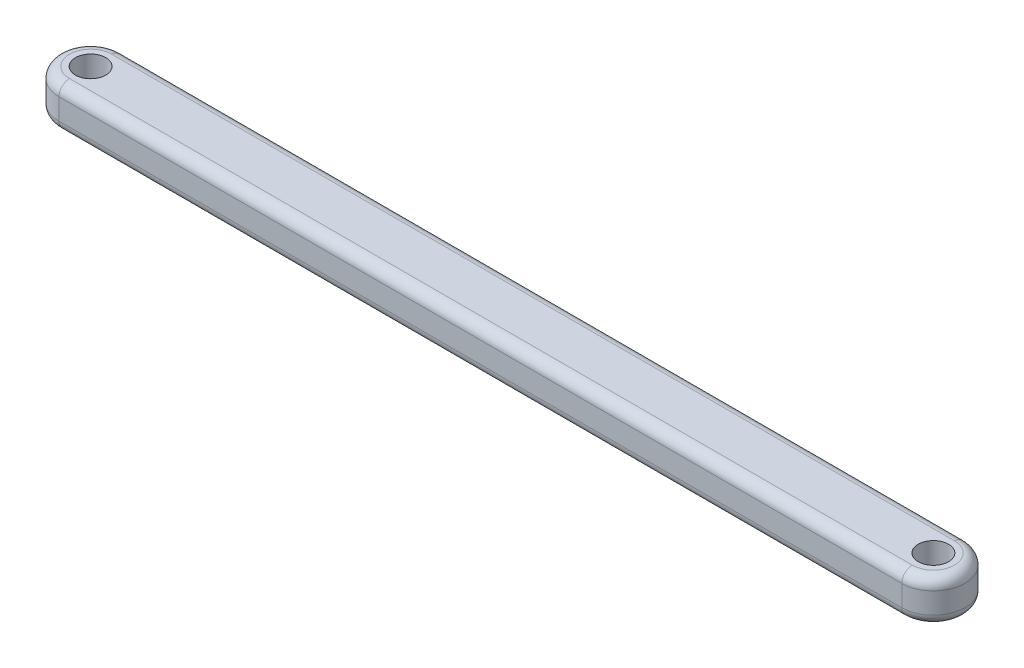
ISO-10303-21;
HEADER;
FILE_DESCRIPTION(('STEP AP214'),'2;1');
FILE_NAME('part.step','',(''),(''),'','','');
FILE_SCHEMA(('AUTOMOTIVE_DESIGN { 1 0 10303 214 1 1 1 1 }'));
ENDSEC;
DATA;
#1=APPLICATION_CONTEXT('core data for automotive mechanical design processes');
#2=APPLICATION_PROTOCOL_DEFINITION('international standard','automotive_design',2000,#1);
#3=PRODUCT_CONTEXT('',#1,'mechanical');
#4=PRODUCT('Part','Part','',(#3));
#5=PRODUCT_RELATED_PRODUCT_CATEGORY('part','',(#4));
#6=PRODUCT_DEFINITION_FORMATION('','',#4);
#7=PRODUCT_DEFINITION_CONTEXT('part definition',#1,'design');
#8=PRODUCT_DEFINITION('design','',#6,#7);
#9=PRODUCT_DEFINITION_SHAPE('','',#8);
#10=(LENGTH_UNIT() NAMED_UNIT(*) SI_UNIT(.MILLI.,.METRE.));
#11=(NAMED_UNIT(*) PLANE_ANGLE_UNIT() SI_UNIT($,.RADIAN.));
#12=(NAMED_UNIT(*) SI_UNIT($,.STERADIAN.) SOLID_ANGLE_UNIT());
#13=UNCERTAINTY_MEASURE_WITH_UNIT(LENGTH_MEASURE(1.E-05),#10,'distance_accuracy_value','');
#14=(GEOMETRIC_REPRESENTATION_CONTEXT(3) GLOBAL_UNCERTAINTY_ASSIGNED_CONTEXT((#13)) GLOBAL_UNIT_ASSIGNED_CONTEXT((#10,
#11,#12)) REPRESENTATION_CONTEXT('',''));
#15=CARTESIAN_POINT('',(0.,0.,0.));
#16=DIRECTION('',(0.,0.,1.));
#17=DIRECTION('',(1.,0.,0.));
#18=AXIS2_PLACEMENT_3D('',#15,#16,#17);
#19=CARTESIAN_POINT('',(0.,3.175,0.));
#20=DIRECTION('',(0.,-1.,0.));
#21=DIRECTION('',(0.,0.,-1.));
#22=AXIS2_PLACEMENT_3D('',#19,#20,#21);
#23=CYLINDRICAL_SURFACE('',#22,4.7625);
#24=DIRECTION('',(0.,-1.,0.));
#25=VECTOR('',#24,1.);
#26=CARTESIAN_POINT('',(0.,3.175,-4.7625));
#27=LINE('',#26,#25);
#28=CARTESIAN_POINT('',(0.,1.5875,-4.7625));
#29=VERTEX_POINT('',#28);
#30=CARTESIAN_POINT('',(0.,-1.5875,-4.7625));
#31=VERTEX_POINT('',#30);
#32=EDGE_CURVE('E117',#29,#31,#27,.T.);
#33=ORIENTED_EDGE('',*,*,#32,.T.);
#34=CARTESIAN_POINT('',(0.,-1.5875,0.));
#35=DIRECTION('',(0.,1.,0.));
#36=DIRECTION('',(0.,0.,1.));
#37=AXIS2_PLACEMENT_3D('',#34,#35,#36);
#38=CIRCLE('',#37,4.7625);
#39=CARTESIAN_POINT('',(0.,-1.5875,4.7625));
#40=VERTEX_POINT('',#39);
#41=EDGE_CURVE('E229',#31,#40,#38,.T.);
#42=ORIENTED_EDGE('',*,*,#41,.T.);
#43=DIRECTION('',(0.,-1.,0.));
#44=VECTOR('',#43,1.);
#45=CARTESIAN_POINT('',(0.,3.175,4.7625));
#46=LINE('',#45,#44);
#47=CARTESIAN_POINT('',(0.,1.5875,4.7625));
#48=VERTEX_POINT('',#47);
#49=EDGE_CURVE('E146',#48,#40,#46,.T.);
#50=ORIENTED_EDGE('',*,*,#49,.F.);
#51=CARTESIAN_POINT('',(0.,1.5875,0.));
#52=DIRECTION('',(0.,1.,0.));
#53=DIRECTION('',(0.,0.,1.));
#54=AXIS2_PLACEMENT_3D('',#51,#52,#53);
#55=CIRCLE('',#54,4.7625);
#56=EDGE_CURVE('E226',#48,#29,#55,.F.);
#57=ORIENTED_EDGE('',*,*,#56,.T.);
#58=EDGE_LOOP('',(#33,#42,#50,#57));
#59=FACE_BOUND('',#58,.T.);
#60=ADVANCED_FACE('F45',(#59),#23,.T.);
#61=CARTESIAN_POINT('',(0.,3.175,4.7625));
#62=DIRECTION('',(0.,0.,-1.));
#63=DIRECTION('',(-1.,0.,0.));
#64=AXIS2_PLACEMENT_3D('',#61,#62,#63);
#65=PLANE('',#64);
#66=ORIENTED_EDGE('',*,*,#49,.T.);
#67=DIRECTION('',(1.,0.,0.));
#68=VECTOR('',#67,1.);
#69=CARTESIAN_POINT('',(0.,-1.5875,4.7625));
#70=LINE('',#69,#68);
#71=CARTESIAN_POINT('',(127.,-1.5875,4.7625));
#72=VERTEX_POINT('',#71);
#73=EDGE_CURVE('E223',#40,#72,#70,.T.);
#74=ORIENTED_EDGE('',*,*,#73,.T.);
#75=DIRECTION('',(0.,-1.,0.));
#76=VECTOR('',#75,1.);
#77=CARTESIAN_POINT('',(127.,3.175,4.7625));
#78=LINE('',#77,#76);
#79=CARTESIAN_POINT('',(127.,1.5875,4.7625));
#80=VERTEX_POINT('',#79);
#81=EDGE_CURVE('E136',#80,#72,#78,.T.);
#82=ORIENTED_EDGE('',*,*,#81,.F.);
#83=DIRECTION('',(1.,0.,0.));
#84=VECTOR('',#83,1.);
#85=CARTESIAN_POINT('',(0.,1.5875,4.7625));
#86=LINE('',#85,#84);
#87=EDGE_CURVE('E220',#80,#48,#86,.F.);
#88=ORIENTED_EDGE('',*,*,#87,.T.);
#89=EDGE_LOOP('',(#66,#74,#82,#88));
#90=FACE_BOUND('',#89,.T.);
#91=ADVANCED_FACE('F246',(#90),#65,.F.);
#92=CARTESIAN_POINT('',(127.,3.175,0.));
#93=DIRECTION('',(0.,-1.,0.));
#94=DIRECTION('',(0.,0.,-1.));
#95=AXIS2_PLACEMENT_3D('',#92,#93,#94);
#96=CYLINDRICAL_SURFACE('',#95,4.7625);
#97=ORIENTED_EDGE('',*,*,#81,.T.);
#98=CARTESIAN_POINT('',(127.,-1.5875,0.));
#99=DIRECTION('',(0.,1.,0.));
#100=DIRECTION('',(0.,0.,1.));
#101=AXIS2_PLACEMENT_3D('',#98,#99,#100);
#102=CIRCLE('',#101,4.7625);
#103=CARTESIAN_POINT('',(127.,-1.5875,-4.7625));
#104=VERTEX_POINT('',#103);
#105=EDGE_CURVE('E134',#72,#104,#102,.T.);
#106=ORIENTED_EDGE('',*,*,#105,.T.);
#107=DIRECTION('',(0.,-1.,0.));
#108=VECTOR('',#107,1.);
#109=CARTESIAN_POINT('',(127.,3.175,-4.7625));
#110=LINE('',#109,#108);
#111=CARTESIAN_POINT('',(127.,1.5875,-4.7625));
#112=VERTEX_POINT('',#111);
#113=EDGE_CURVE('E115',#112,#104,#110,.T.);
#114=ORIENTED_EDGE('',*,*,#113,.F.);
#115=CARTESIAN_POINT('',(127.,1.5875,0.));
#116=DIRECTION('',(0.,1.,0.));
#117=DIRECTION('',(0.,0.,1.));
#118=AXIS2_PLACEMENT_3D('',#115,#116,#117);
#119=CIRCLE('',#118,4.7625);
#120=EDGE_CURVE('E131',#112,#80,#119,.F.);
#121=ORIENTED_EDGE('',*,*,#120,.T.);
#122=EDGE_LOOP('',(#97,#106,#114,#121));
#123=FACE_BOUND('',#122,.T.);
#124=ADVANCED_FACE('F130',(#123),#96,.T.);
#125=CARTESIAN_POINT('',(0.,3.175,-4.7625));
#126=DIRECTION('',(0.,0.,1.));
#127=DIRECTION('',(1.,0.,0.));
#128=AXIS2_PLACEMENT_3D('',#125,#126,#127);
#129=PLANE('',#128);
#130=ORIENTED_EDGE('',*,*,#113,.T.);
#131=DIRECTION('',(-1.,0.,0.));
#132=VECTOR('',#131,1.);
#133=CARTESIAN_POINT('',(0.,-1.5875,-4.7625));
#134=LINE('',#133,#132);
#135=EDGE_CURVE('E11',#104,#31,#134,.T.);
#136=ORIENTED_EDGE('',*,*,#135,.T.);
#137=ORIENTED_EDGE('',*,*,#32,.F.);
#138=DIRECTION('',(-1.,0.,0.));
#139=VECTOR('',#138,1.);
#140=CARTESIAN_POINT('',(127.,1.5875,-4.7625));
#141=LINE('',#140,#139);
#142=EDGE_CURVE('E55',#29,#112,#141,.F.);
#143=ORIENTED_EDGE('',*,*,#142,.T.);
#144=EDGE_LOOP('',(#130,#136,#137,#143));
#145=FACE_BOUND('',#144,.T.);
#146=ADVANCED_FACE('F114',(#145),#129,.F.);
#147=CARTESIAN_POINT('',(0.,3.175,0.));
#148=DIRECTION('',(0.,1.,0.));
#149=DIRECTION('',(0.,0.,1.));
#150=AXIS2_PLACEMENT_3D('',#147,#148,#149);
#151=PLANE('',#150);
#152=DIRECTION('',(1.,0.,0.));
#153=VECTOR('',#152,1.);
#154=CARTESIAN_POINT('',(127.,3.175,3.175));
#155=LINE('',#154,#153);
#156=CARTESIAN_POINT('',(0.,3.175,3.175));
#157=VERTEX_POINT('',#156);
#158=CARTESIAN_POINT('',(127.,3.175,3.175));
#159=VERTEX_POINT('',#158);
#160=EDGE_CURVE('E63',#157,#159,#155,.T.);
#161=ORIENTED_EDGE('',*,*,#160,.T.);
#162=CARTESIAN_POINT('',(127.,3.175,0.));
#163=DIRECTION('',(0.,1.,0.));
#164=DIRECTION('',(0.,0.,1.));
#165=AXIS2_PLACEMENT_3D('',#162,#163,#164);
#166=CIRCLE('',#165,3.175);
#167=CARTESIAN_POINT('',(127.,3.175,-3.175));
#168=VERTEX_POINT('',#167);
#169=EDGE_CURVE('E123',#159,#168,#166,.T.);
#170=ORIENTED_EDGE('',*,*,#169,.T.);
#171=DIRECTION('',(-1.,0.,0.));
#172=VECTOR('',#171,1.);
#173=CARTESIAN_POINT('',(0.,3.175,-3.175));
#174=LINE('',#173,#172);
#175=CARTESIAN_POINT('',(0.,3.175,-3.175));
#176=VERTEX_POINT('',#175);
#177=EDGE_CURVE('E149',#168,#176,#174,.T.);
#178=ORIENTED_EDGE('',*,*,#177,.T.);
#179=CARTESIAN_POINT('',(0.,3.175,0.));
#180=DIRECTION('',(0.,1.,0.));
#181=DIRECTION('',(0.,0.,1.));
#182=AXIS2_PLACEMENT_3D('',#179,#180,#181);
#183=CIRCLE('',#182,3.175);
#184=EDGE_CURVE('E68',#176,#157,#183,.T.);
#185=ORIENTED_EDGE('',*,*,#184,.T.);
#186=EDGE_LOOP('',(#161,#170,#178,#185));
#187=FACE_BOUND('',#186,.T.);
#188=CARTESIAN_POINT('',(0.,3.175,0.));
#189=DIRECTION('',(0.,1.,0.));
#190=DIRECTION('',(0.,0.,1.));
#191=AXIS2_PLACEMENT_3D('',#188,#189,#190);
#192=CIRCLE('',#191,2.286);
#193=CARTESIAN_POINT('',(0.,3.175,2.286));
#194=VERTEX_POINT('',#193);
#195=EDGE_CURVE('E193',#194,#194,#192,.T.);
#196=ORIENTED_EDGE('',*,*,#195,.F.);
#197=EDGE_LOOP('',(#196));
#198=FACE_BOUND('',#197,.T.);
#199=CARTESIAN_POINT('',(127.,3.175,0.));
#200=DIRECTION('',(0.,1.,0.));
#201=DIRECTION('',(0.,0.,1.));
#202=AXIS2_PLACEMENT_3D('',#199,#200,#201);
#203=CIRCLE('',#202,2.28600000000001);
#204=CARTESIAN_POINT('',(127.,3.175,2.28600000000001));
#205=VERTEX_POINT('',#204);
#206=EDGE_CURVE('E187',#205,#205,#203,.T.);
#207=ORIENTED_EDGE('',*,*,#206,.F.);
#208=EDGE_LOOP('',(#207));
#209=FACE_BOUND('',#208,.T.);
#210=ADVANCED_FACE('F239',(#187,#198,#209),#151,.T.);
#211=CARTESIAN_POINT('',(0.,-3.175,0.));
#212=DIRECTION('',(0.,1.,0.));
#213=DIRECTION('',(0.,0.,1.));
#214=AXIS2_PLACEMENT_3D('',#211,#212,#213);
#215=PLANE('',#214);
#216=DIRECTION('',(-1.,0.,0.));
#217=VECTOR('',#216,1.);
#218=CARTESIAN_POINT('',(0.,-3.175,-3.175));
#219=LINE('',#218,#217);
#220=CARTESIAN_POINT('',(0.,-3.175,-3.175));
#221=VERTEX_POINT('',#220);
#222=CARTESIAN_POINT('',(127.,-3.175,-3.175));
#223=VERTEX_POINT('',#222);
#224=EDGE_CURVE('E207',#221,#223,#219,.F.);
#225=ORIENTED_EDGE('',*,*,#224,.T.);
#226=CARTESIAN_POINT('',(127.,-3.175,0.));
#227=DIRECTION('',(0.,1.,0.));
#228=DIRECTION('',(0.,0.,1.));
#229=AXIS2_PLACEMENT_3D('',#226,#227,#228);
#230=CIRCLE('',#229,3.175);
#231=CARTESIAN_POINT('',(127.,-3.175,3.175));
#232=VERTEX_POINT('',#231);
#233=EDGE_CURVE('E216',#223,#232,#230,.F.);
#234=ORIENTED_EDGE('',*,*,#233,.T.);
#235=DIRECTION('',(1.,0.,0.));
#236=VECTOR('',#235,1.);
#237=CARTESIAN_POINT('',(0.,-3.175,3.175));
#238=LINE('',#237,#236);
#239=CARTESIAN_POINT('',(0.,-3.175,3.175));
#240=VERTEX_POINT('',#239);
#241=EDGE_CURVE('E213',#232,#240,#238,.F.);
#242=ORIENTED_EDGE('',*,*,#241,.T.);
#243=CARTESIAN_POINT('',(0.,-3.175,0.));
#244=DIRECTION('',(0.,1.,0.));
#245=DIRECTION('',(0.,0.,1.));
#246=AXIS2_PLACEMENT_3D('',#243,#244,#245);
#247=CIRCLE('',#246,3.175);
#248=EDGE_CURVE('E210',#240,#221,#247,.F.);
#249=ORIENTED_EDGE('',*,*,#248,.T.);
#250=EDGE_LOOP('',(#225,#234,#242,#249));
#251=FACE_BOUND('',#250,.T.);
#252=CARTESIAN_POINT('',(0.,-3.175,0.));
#253=DIRECTION('',(0.,1.,0.));
#254=DIRECTION('',(0.,0.,1.));
#255=AXIS2_PLACEMENT_3D('',#252,#253,#254);
#256=CIRCLE('',#255,2.286);
#257=CARTESIAN_POINT('',(0.,-3.175,2.286));
#258=VERTEX_POINT('',#257);
#259=EDGE_CURVE('E198',#258,#258,#256,.T.);
#260=ORIENTED_EDGE('',*,*,#259,.T.);
#261=EDGE_LOOP('',(#260));
#262=FACE_BOUND('',#261,.T.);
#263=CARTESIAN_POINT('',(127.,-3.175,0.));
#264=DIRECTION('',(0.,1.,0.));
#265=DIRECTION('',(0.,0.,1.));
#266=AXIS2_PLACEMENT_3D('',#263,#264,#265);
#267=CIRCLE('',#266,2.28600000000001);
#268=CARTESIAN_POINT('',(127.,-3.175,2.28600000000001));
#269=VERTEX_POINT('',#268);
#270=EDGE_CURVE('E180',#269,#269,#267,.T.);
#271=ORIENTED_EDGE('',*,*,#270,.T.);
#272=EDGE_LOOP('',(#271));
#273=FACE_BOUND('',#272,.T.);
#274=ADVANCED_FACE('F275',(#251,#262,#273),#215,.F.);
#275=CARTESIAN_POINT('',(127.,-3.175,0.));
#276=DIRECTION('',(0.,1.,0.));
#277=DIRECTION('',(0.,0.,1.));
#278=AXIS2_PLACEMENT_3D('',#275,#276,#277);
#279=CYLINDRICAL_SURFACE('',#278,2.28600000000001);
#280=ORIENTED_EDGE('',*,*,#270,.F.);
#281=EDGE_LOOP('',(#280));
#282=FACE_BOUND('',#281,.T.);
#283=ORIENTED_EDGE('',*,*,#206,.T.);
#284=EDGE_LOOP('',(#283));
#285=FACE_BOUND('',#284,.T.);
#286=ADVANCED_FACE('F278',(#282,#285),#279,.F.);
#287=CARTESIAN_POINT('',(0.,-3.175,0.));
#288=DIRECTION('',(0.,1.,0.));
#289=DIRECTION('',(0.,0.,1.));
#290=AXIS2_PLACEMENT_3D('',#287,#288,#289);
#291=CYLINDRICAL_SURFACE('',#290,2.286);
#292=ORIENTED_EDGE('',*,*,#259,.F.);
#293=EDGE_LOOP('',(#292));
#294=FACE_BOUND('',#293,.T.);
#295=ORIENTED_EDGE('',*,*,#195,.T.);
#296=EDGE_LOOP('',(#295));
#297=FACE_BOUND('',#296,.T.);
#298=ADVANCED_FACE('F284',(#294,#297),#291,.F.);
#299=CARTESIAN_POINT('',(0.,-1.5875,0.));
#300=DIRECTION('',(0.,1.,0.));
#301=DIRECTION('',(0.,0.,1.));
#302=AXIS2_PLACEMENT_3D('',#299,#300,#301);
#303=TOROIDAL_SURFACE('',#302,3.175,1.5875);
#304=CARTESIAN_POINT('',(0.,-1.5875,-3.175));
#305=DIRECTION('',(1.,0.,0.));
#306=DIRECTION('',(0.,0.,-1.));
#307=AXIS2_PLACEMENT_3D('',#304,#305,#306);
#308=CIRCLE('',#307,1.5875);
#309=EDGE_CURVE('E171',#221,#31,#308,.T.);
#310=ORIENTED_EDGE('',*,*,#309,.F.);
#311=ORIENTED_EDGE('',*,*,#248,.F.);
#312=CARTESIAN_POINT('',(0.,-1.5875,3.175));
#313=DIRECTION('',(1.,0.,0.));
#314=DIRECTION('',(0.,0.,-1.));
#315=AXIS2_PLACEMENT_3D('',#312,#313,#314);
#316=CIRCLE('',#315,1.5875);
#317=EDGE_CURVE('E156',#40,#240,#316,.T.);
#318=ORIENTED_EDGE('',*,*,#317,.F.);
#319=ORIENTED_EDGE('',*,*,#41,.F.);
#320=EDGE_LOOP('',(#310,#311,#318,#319));
#321=FACE_BOUND('',#320,.T.);
#322=ADVANCED_FACE('F250',(#321),#303,.T.);
#323=CARTESIAN_POINT('',(0.,-1.5875,3.175));
#324=DIRECTION('',(1.,0.,0.));
#325=DIRECTION('',(0.,0.,-1.));
#326=AXIS2_PLACEMENT_3D('',#323,#324,#325);
#327=CYLINDRICAL_SURFACE('',#326,1.5875);
#328=ORIENTED_EDGE('',*,*,#317,.T.);
#329=ORIENTED_EDGE('',*,*,#241,.F.);
#330=CARTESIAN_POINT('',(127.,-1.5875,3.175));
#331=DIRECTION('',(1.,0.,0.));
#332=DIRECTION('',(0.,0.,-1.));
#333=AXIS2_PLACEMENT_3D('',#330,#331,#332);
#334=CIRCLE('',#333,1.5875);
#335=EDGE_CURVE('E164',#72,#232,#334,.T.);
#336=ORIENTED_EDGE('',*,*,#335,.F.);
#337=ORIENTED_EDGE('',*,*,#73,.F.);
#338=EDGE_LOOP('',(#328,#329,#336,#337));
#339=FACE_BOUND('',#338,.T.);
#340=ADVANCED_FACE('F253',(#339),#327,.T.);
#341=CARTESIAN_POINT('',(0.,-1.5875,-3.175));
#342=DIRECTION('',(-1.,0.,0.));
#343=DIRECTION('',(0.,0.,1.));
#344=AXIS2_PLACEMENT_3D('',#341,#342,#343);
#345=CYLINDRICAL_SURFACE('',#344,1.5875);
#346=ORIENTED_EDGE('',*,*,#309,.T.);
#347=ORIENTED_EDGE('',*,*,#135,.F.);
#348=CARTESIAN_POINT('',(127.,-1.5875,-3.175));
#349=DIRECTION('',(1.,0.,0.));
#350=DIRECTION('',(0.,0.,-1.));
#351=AXIS2_PLACEMENT_3D('',#348,#349,#350);
#352=CIRCLE('',#351,1.5875);
#353=EDGE_CURVE('E161',#223,#104,#352,.T.);
#354=ORIENTED_EDGE('',*,*,#353,.F.);
#355=ORIENTED_EDGE('',*,*,#224,.F.);
#356=EDGE_LOOP('',(#346,#347,#354,#355));
#357=FACE_BOUND('',#356,.T.);
#358=ADVANCED_FACE('F256',(#357),#345,.T.);
#359=CARTESIAN_POINT('',(127.,-1.5875,0.));
#360=DIRECTION('',(0.,1.,0.));
#361=DIRECTION('',(0.,0.,1.));
#362=AXIS2_PLACEMENT_3D('',#359,#360,#361);
#363=TOROIDAL_SURFACE('',#362,3.175,1.5875);
#364=ORIENTED_EDGE('',*,*,#335,.T.);
#365=ORIENTED_EDGE('',*,*,#233,.F.);
#366=ORIENTED_EDGE('',*,*,#353,.T.);
#367=ORIENTED_EDGE('',*,*,#105,.F.);
#368=EDGE_LOOP('',(#364,#365,#366,#367));
#369=FACE_BOUND('',#368,.T.);
#370=ADVANCED_FACE('F254',(#369),#363,.T.);
#371=CARTESIAN_POINT('',(0.,1.5875,0.));
#372=DIRECTION('',(0.,1.,0.));
#373=DIRECTION('',(0.,0.,1.));
#374=AXIS2_PLACEMENT_3D('',#371,#372,#373);
#375=TOROIDAL_SURFACE('',#374,3.175,1.5875);
#376=CARTESIAN_POINT('',(0.,1.5875,-3.175));
#377=DIRECTION('',(1.,0.,0.));
#378=DIRECTION('',(0.,0.,-1.));
#379=AXIS2_PLACEMENT_3D('',#376,#377,#378);
#380=CIRCLE('',#379,1.5875);
#381=EDGE_CURVE('E153',#29,#176,#380,.T.);
#382=ORIENTED_EDGE('',*,*,#381,.F.);
#383=ORIENTED_EDGE('',*,*,#56,.F.);
#384=CARTESIAN_POINT('',(0.,1.5875,3.175));
#385=DIRECTION('',(1.,0.,0.));
#386=DIRECTION('',(0.,0.,-1.));
#387=AXIS2_PLACEMENT_3D('',#384,#385,#386);
#388=CIRCLE('',#387,1.5875);
#389=EDGE_CURVE('E49',#157,#48,#388,.T.);
#390=ORIENTED_EDGE('',*,*,#389,.F.);
#391=ORIENTED_EDGE('',*,*,#184,.F.);
#392=EDGE_LOOP('',(#382,#383,#390,#391));
#393=FACE_BOUND('',#392,.T.);
#394=ADVANCED_FACE('F47',(#393),#375,.T.);
#395=CARTESIAN_POINT('',(0.,1.5875,3.175));
#396=DIRECTION('',(-1.,0.,0.));
#397=DIRECTION('',(0.,0.,1.));
#398=AXIS2_PLACEMENT_3D('',#395,#396,#397);
#399=CYLINDRICAL_SURFACE('',#398,1.5875);
#400=ORIENTED_EDGE('',*,*,#389,.T.);
#401=ORIENTED_EDGE('',*,*,#87,.F.);
#402=CARTESIAN_POINT('',(127.,1.5875,3.175));
#403=DIRECTION('',(1.,0.,0.));
#404=DIRECTION('',(0.,0.,-1.));
#405=AXIS2_PLACEMENT_3D('',#402,#403,#404);
#406=CIRCLE('',#405,1.5875);
#407=EDGE_CURVE('E143',#159,#80,#406,.T.);
#408=ORIENTED_EDGE('',*,*,#407,.F.);
#409=ORIENTED_EDGE('',*,*,#160,.F.);
#410=EDGE_LOOP('',(#400,#401,#408,#409));
#411=FACE_BOUND('',#410,.T.);
#412=ADVANCED_FACE('F243',(#411),#399,.T.);
#413=CARTESIAN_POINT('',(0.,1.5875,-3.175));
#414=DIRECTION('',(1.,0.,0.));
#415=DIRECTION('',(0.,0.,-1.));
#416=AXIS2_PLACEMENT_3D('',#413,#414,#415);
#417=CYLINDRICAL_SURFACE('',#416,1.5875);
#418=ORIENTED_EDGE('',*,*,#381,.T.);
#419=ORIENTED_EDGE('',*,*,#177,.F.);
#420=CARTESIAN_POINT('',(127.,1.5875,-3.175));
#421=DIRECTION('',(1.,0.,0.));
#422=DIRECTION('',(0.,0.,-1.));
#423=AXIS2_PLACEMENT_3D('',#420,#421,#422);
#424=CIRCLE('',#423,1.5875);
#425=EDGE_CURVE('E141',#112,#168,#424,.T.);
#426=ORIENTED_EDGE('',*,*,#425,.F.);
#427=ORIENTED_EDGE('',*,*,#142,.F.);
#428=EDGE_LOOP('',(#418,#419,#426,#427));
#429=FACE_BOUND('',#428,.T.);
#430=ADVANCED_FACE('F148',(#429),#417,.T.);
#431=CARTESIAN_POINT('',(127.,1.5875,0.));
#432=DIRECTION('',(0.,1.,0.));
#433=DIRECTION('',(0.,0.,1.));
#434=AXIS2_PLACEMENT_3D('',#431,#432,#433);
#435=TOROIDAL_SURFACE('',#434,3.175,1.5875);
#436=ORIENTED_EDGE('',*,*,#407,.T.);
#437=ORIENTED_EDGE('',*,*,#120,.F.);
#438=ORIENTED_EDGE('',*,*,#425,.T.);
#439=ORIENTED_EDGE('',*,*,#169,.F.);
#440=EDGE_LOOP('',(#436,#437,#438,#439));
#441=FACE_BOUND('',#440,.T.);
#442=ADVANCED_FACE('F139',(#441),#435,.T.);
#443=CLOSED_SHELL('',(#60,#91,#124,#146,#210,#274,#286,#298,#322,#340,#358,#370,#394,#412,#430,#442));
#444=MANIFOLD_SOLID_BREP('B2',#443);
#445=ADVANCED_BREP_SHAPE_REPRESENTATION('',(#18,#444),#14);
#446=SHAPE_DEFINITION_REPRESENTATION(#9,#445);
ENDSEC;
END-ISO-10303-21;
